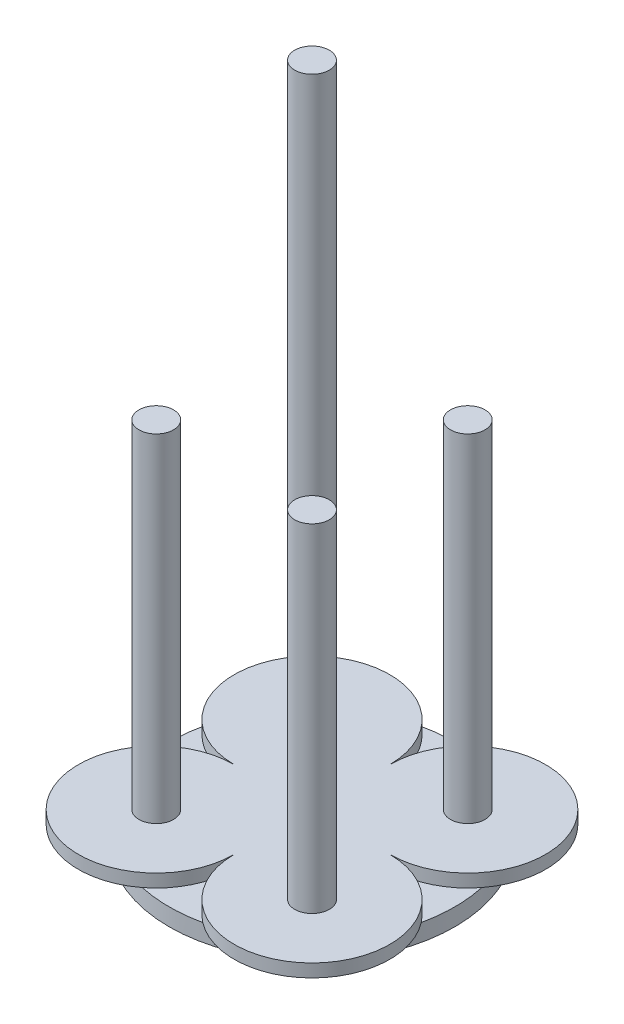
ISO-10303-21;
HEADER;
FILE_DESCRIPTION(('STEP AP214'),'2;1');
FILE_NAME('part.step','',(''),(''),'','','');
FILE_SCHEMA(('AUTOMOTIVE_DESIGN { 1 0 10303 214 1 1 1 1 }'));
ENDSEC;
DATA;
#1=APPLICATION_CONTEXT('core data for automotive mechanical design processes');
#2=APPLICATION_PROTOCOL_DEFINITION('international standard','automotive_design',2000,#1);
#3=PRODUCT_CONTEXT('',#1,'mechanical');
#4=PRODUCT('Part','Part','',(#3));
#5=PRODUCT_RELATED_PRODUCT_CATEGORY('part','',(#4));
#6=PRODUCT_DEFINITION_FORMATION('','',#4);
#7=PRODUCT_DEFINITION_CONTEXT('part definition',#1,'design');
#8=PRODUCT_DEFINITION('design','',#6,#7);
#9=PRODUCT_DEFINITION_SHAPE('','',#8);
#10=(LENGTH_UNIT() NAMED_UNIT(*) SI_UNIT(.MILLI.,.METRE.));
#11=(NAMED_UNIT(*) PLANE_ANGLE_UNIT() SI_UNIT($,.RADIAN.));
#12=(NAMED_UNIT(*) SI_UNIT($,.STERADIAN.) SOLID_ANGLE_UNIT());
#13=UNCERTAINTY_MEASURE_WITH_UNIT(LENGTH_MEASURE(1.E-05),#10,'distance_accuracy_value','');
#14=(GEOMETRIC_REPRESENTATION_CONTEXT(3) GLOBAL_UNCERTAINTY_ASSIGNED_CONTEXT((#13)) GLOBAL_UNIT_ASSIGNED_CONTEXT((#10,
#11,#12)) REPRESENTATION_CONTEXT('',''));
#15=CARTESIAN_POINT('',(0.,0.,0.));
#16=DIRECTION('',(0.,0.,1.));
#17=DIRECTION('',(1.,0.,0.));
#18=AXIS2_PLACEMENT_3D('',#15,#16,#17);
#19=CARTESIAN_POINT('',(0.,4.,0.));
#20=DIRECTION('',(0.,1.,0.));
#21=DIRECTION('',(0.,0.,1.));
#22=AXIS2_PLACEMENT_3D('',#19,#20,#21);
#23=PLANE('',#22);
#24=CARTESIAN_POINT('',(-17.9999999999998,4.,-18.0000000000002));
#25=DIRECTION('',(0.,1.,0.));
#26=DIRECTION('',(0.,0.,1.));
#27=AXIS2_PLACEMENT_3D('',#24,#25,#26);
#28=CIRCLE('',#27,18.);
#29=CARTESIAN_POINT('',(0.,4.,-18.0000000000002));
#30=VERTEX_POINT('',#29);
#31=CARTESIAN_POINT('',(-7.00123768442987,4.,-32.2487623155699));
#32=VERTEX_POINT('',#31);
#33=EDGE_CURVE('E59',#30,#32,#28,.T.);
#34=ORIENTED_EDGE('',*,*,#33,.F.);
#35=CARTESIAN_POINT('',(18.,4.,-18.));
#36=DIRECTION('',(0.,1.,0.));
#37=DIRECTION('',(0.,0.,1.));
#38=AXIS2_PLACEMENT_3D('',#35,#36,#37);
#39=CIRCLE('',#38,18.);
#40=CARTESIAN_POINT('',(7.0012376844302,4.,-32.2487623155698));
#41=VERTEX_POINT('',#40);
#42=EDGE_CURVE('E11',#41,#30,#39,.T.);
#43=ORIENTED_EDGE('',*,*,#42,.F.);
#44=CARTESIAN_POINT('',(0.,4.,0.));
#45=DIRECTION('',(0.,1.,0.));
#46=DIRECTION('',(0.,0.,1.));
#47=AXIS2_PLACEMENT_3D('',#44,#45,#46);
#48=CIRCLE('',#47,33.);
#49=EDGE_CURVE('E166',#41,#32,#48,.T.);
#50=ORIENTED_EDGE('',*,*,#49,.T.);
#51=EDGE_LOOP('',(#34,#43,#50));
#52=FACE_BOUND('',#51,.T.);
#53=ADVANCED_FACE('F40',(#52),#23,.T.);
#54=CARTESIAN_POINT('',(17.9999999999999,4.,0.));
#55=VERTEX_POINT('',#54);
#56=CARTESIAN_POINT('',(32.2487623155698,4.,-7.0012376844302));
#57=VERTEX_POINT('',#56);
#58=EDGE_CURVE('E51',#55,#57,#39,.T.);
#59=ORIENTED_EDGE('',*,*,#58,.F.);
#60=CARTESIAN_POINT('',(17.9999999999999,4.,18.0000000000001));
#61=DIRECTION('',(0.,1.,0.));
#62=DIRECTION('',(0.,0.,1.));
#63=AXIS2_PLACEMENT_3D('',#60,#61,#62);
#64=CIRCLE('',#63,18.);
#65=CARTESIAN_POINT('',(32.2487623155698,4.,7.00123768443031));
#66=VERTEX_POINT('',#65);
#67=EDGE_CURVE('E49',#66,#55,#64,.T.);
#68=ORIENTED_EDGE('',*,*,#67,.F.);
#69=EDGE_CURVE('E144',#66,#57,#48,.T.);
#70=ORIENTED_EDGE('',*,*,#69,.T.);
#71=EDGE_LOOP('',(#59,#68,#70));
#72=FACE_BOUND('',#71,.T.);
#73=ADVANCED_FACE('F258',(#72),#23,.T.);
#74=CARTESIAN_POINT('',(-32.2487623155697,4.,-7.00123768443053));
#75=VERTEX_POINT('',#74);
#76=CARTESIAN_POINT('',(-17.9999999999998,4.,-1.2490009027033E-13));
#77=VERTEX_POINT('',#76);
#78=EDGE_CURVE('E134',#75,#77,#28,.T.);
#79=ORIENTED_EDGE('',*,*,#78,.F.);
#80=CARTESIAN_POINT('',(-32.2487623155698,4.,7.00123768442998));
#81=VERTEX_POINT('',#80);
#82=EDGE_CURVE('E157',#75,#81,#48,.T.);
#83=ORIENTED_EDGE('',*,*,#82,.T.);
#84=CARTESIAN_POINT('',(-18.0000000000001,4.,17.9999999999999));
#85=DIRECTION('',(0.,1.,0.));
#86=DIRECTION('',(0.,0.,1.));
#87=AXIS2_PLACEMENT_3D('',#84,#85,#86);
#88=CIRCLE('',#87,18.);
#89=EDGE_CURVE('E150',#77,#81,#88,.T.);
#90=ORIENTED_EDGE('',*,*,#89,.F.);
#91=EDGE_LOOP('',(#79,#83,#90));
#92=FACE_BOUND('',#91,.T.);
#93=ADVANCED_FACE('F264',(#92),#23,.T.);
#94=CARTESIAN_POINT('',(0.,4.,0.));
#95=DIRECTION('',(0.,-1.,0.));
#96=DIRECTION('',(0.,0.,-1.));
#97=AXIS2_PLACEMENT_3D('',#94,#95,#96);
#98=CYLINDRICAL_SURFACE('',#97,33.);
#99=CARTESIAN_POINT('',(7.00123768443009,4.,32.2487623155698));
#100=VERTEX_POINT('',#99);
#101=EDGE_CURVE('E141',#100,#66,#48,.T.);
#102=ORIENTED_EDGE('',*,*,#101,.F.);
#103=CARTESIAN_POINT('',(-7.00123768443043,4.,32.2487623155697));
#104=VERTEX_POINT('',#103);
#105=EDGE_CURVE('E137',#104,#100,#48,.T.);
#106=ORIENTED_EDGE('',*,*,#105,.F.);
#107=EDGE_CURVE('E153',#81,#104,#48,.T.);
#108=ORIENTED_EDGE('',*,*,#107,.F.);
#109=ORIENTED_EDGE('',*,*,#82,.F.);
#110=EDGE_CURVE('E162',#32,#75,#48,.T.);
#111=ORIENTED_EDGE('',*,*,#110,.F.);
#112=ORIENTED_EDGE('',*,*,#49,.F.);
#113=EDGE_CURVE('E152',#57,#41,#48,.T.);
#114=ORIENTED_EDGE('',*,*,#113,.F.);
#115=ORIENTED_EDGE('',*,*,#69,.F.);
#116=EDGE_LOOP('',(#102,#106,#108,#109,#111,#112,#114,#115));
#117=FACE_BOUND('',#116,.T.);
#118=CARTESIAN_POINT('',(0.,0.,0.));
#119=DIRECTION('',(0.,1.,0.));
#120=DIRECTION('',(0.,0.,1.));
#121=AXIS2_PLACEMENT_3D('',#118,#119,#120);
#122=CIRCLE('',#121,33.);
#123=CARTESIAN_POINT('',(0.,0.,33.));
#124=VERTEX_POINT('',#123);
#125=EDGE_CURVE('E44',#124,#124,#122,.T.);
#126=ORIENTED_EDGE('',*,*,#125,.T.);
#127=EDGE_LOOP('',(#126));
#128=FACE_BOUND('',#127,.T.);
#129=ADVANCED_FACE('F42',(#117,#128),#98,.T.);
#130=CARTESIAN_POINT('',(-1.2490009027033E-13,4.,17.9999999999999));
#131=VERTEX_POINT('',#130);
#132=EDGE_CURVE('E180',#131,#100,#64,.T.);
#133=ORIENTED_EDGE('',*,*,#132,.F.);
#134=EDGE_CURVE('E143',#104,#131,#88,.T.);
#135=ORIENTED_EDGE('',*,*,#134,.F.);
#136=ORIENTED_EDGE('',*,*,#105,.T.);
#137=EDGE_LOOP('',(#133,#135,#136));
#138=FACE_BOUND('',#137,.T.);
#139=ADVANCED_FACE('F260',(#138),#23,.T.);
#140=CARTESIAN_POINT('',(0.,0.,0.));
#141=DIRECTION('',(0.,1.,0.));
#142=DIRECTION('',(0.,0.,1.));
#143=AXIS2_PLACEMENT_3D('',#140,#141,#142);
#144=PLANE('',#143);
#145=ORIENTED_EDGE('',*,*,#125,.F.);
#146=EDGE_LOOP('',(#145));
#147=FACE_BOUND('',#146,.T.);
#148=ADVANCED_FACE('F267',(#147),#144,.F.);
#149=CARTESIAN_POINT('',(-18.,4.,-1.56125112837913E-13));
#150=DIRECTION('',(0.,1.,0.));
#151=DIRECTION('',(0.,0.,1.));
#152=AXIS2_PLACEMENT_3D('',#149,#150,#151);
#153=PLANE('',#152);
#154=EDGE_CURVE('E182',#100,#66,#64,.T.);
#155=ORIENTED_EDGE('',*,*,#154,.F.);
#156=ORIENTED_EDGE('',*,*,#101,.T.);
#157=EDGE_LOOP('',(#155,#156));
#158=FACE_BOUND('',#157,.T.);
#159=ADVANCED_FACE('F272',(#158),#153,.F.);
#160=EDGE_CURVE('E52',#57,#41,#39,.T.);
#161=ORIENTED_EDGE('',*,*,#160,.F.);
#162=ORIENTED_EDGE('',*,*,#113,.T.);
#163=EDGE_LOOP('',(#161,#162));
#164=FACE_BOUND('',#163,.T.);
#165=ADVANCED_FACE('F174',(#164),#153,.F.);
#166=EDGE_CURVE('E190',#32,#75,#28,.T.);
#167=ORIENTED_EDGE('',*,*,#166,.F.);
#168=ORIENTED_EDGE('',*,*,#110,.T.);
#169=EDGE_LOOP('',(#167,#168));
#170=FACE_BOUND('',#169,.T.);
#171=ADVANCED_FACE('F280',(#170),#153,.F.);
#172=EDGE_CURVE('E151',#81,#104,#88,.T.);
#173=ORIENTED_EDGE('',*,*,#172,.F.);
#174=ORIENTED_EDGE('',*,*,#107,.T.);
#175=EDGE_LOOP('',(#173,#174));
#176=FACE_BOUND('',#175,.T.);
#177=ADVANCED_FACE('F278',(#176),#153,.F.);
#178=CARTESIAN_POINT('',(-17.9999999999998,7.,-18.0000000000002));
#179=DIRECTION('',(0.,-1.,0.));
#180=DIRECTION('',(0.,0.,-1.));
#181=AXIS2_PLACEMENT_3D('',#178,#179,#180);
#182=CYLINDRICAL_SURFACE('',#181,18.);
#183=ORIENTED_EDGE('',*,*,#33,.T.);
#184=ORIENTED_EDGE('',*,*,#166,.T.);
#185=ORIENTED_EDGE('',*,*,#78,.T.);
#186=DIRECTION('',(0.,-1.,0.));
#187=VECTOR('',#186,1.);
#188=CARTESIAN_POINT('',(-17.9999999999998,7.,-1.2490009027033E-13));
#189=LINE('',#188,#187);
#190=CARTESIAN_POINT('',(-17.9999999999998,7.,-1.2490009027033E-13));
#191=VERTEX_POINT('',#190);
#192=EDGE_CURVE('E114',#191,#77,#189,.T.);
#193=ORIENTED_EDGE('',*,*,#192,.F.);
#194=CARTESIAN_POINT('',(-17.9999999999998,7.,-18.0000000000002));
#195=DIRECTION('',(0.,1.,0.));
#196=DIRECTION('',(0.,0.,1.));
#197=AXIS2_PLACEMENT_3D('',#194,#195,#196);
#198=CIRCLE('',#197,18.);
#199=CARTESIAN_POINT('',(0.,7.,-18.0000000000002));
#200=VERTEX_POINT('',#199);
#201=EDGE_CURVE('E121',#200,#191,#198,.T.);
#202=ORIENTED_EDGE('',*,*,#201,.F.);
#203=DIRECTION('',(0.,-1.,0.));
#204=VECTOR('',#203,1.);
#205=CARTESIAN_POINT('',(0.,7.,-18.0000000000002));
#206=LINE('',#205,#204);
#207=EDGE_CURVE('E185',#200,#30,#206,.T.);
#208=ORIENTED_EDGE('',*,*,#207,.T.);
#209=EDGE_LOOP('',(#183,#184,#185,#193,#202,#208));
#210=FACE_BOUND('',#209,.T.);
#211=ADVANCED_FACE('F132',(#210),#182,.T.);
#212=CARTESIAN_POINT('',(-18.0000000000001,7.,17.9999999999999));
#213=DIRECTION('',(0.,-1.,0.));
#214=DIRECTION('',(0.,0.,-1.));
#215=AXIS2_PLACEMENT_3D('',#212,#213,#214);
#216=CYLINDRICAL_SURFACE('',#215,18.);
#217=ORIENTED_EDGE('',*,*,#89,.T.);
#218=ORIENTED_EDGE('',*,*,#172,.T.);
#219=ORIENTED_EDGE('',*,*,#134,.T.);
#220=DIRECTION('',(0.,-1.,0.));
#221=VECTOR('',#220,1.);
#222=CARTESIAN_POINT('',(-1.2490009027033E-13,7.,17.9999999999999));
#223=LINE('',#222,#221);
#224=CARTESIAN_POINT('',(-1.2490009027033E-13,7.,17.9999999999999));
#225=VERTEX_POINT('',#224);
#226=EDGE_CURVE('E117',#225,#131,#223,.T.);
#227=ORIENTED_EDGE('',*,*,#226,.F.);
#228=CARTESIAN_POINT('',(-18.0000000000001,7.,17.9999999999999));
#229=DIRECTION('',(0.,1.,0.));
#230=DIRECTION('',(0.,0.,1.));
#231=AXIS2_PLACEMENT_3D('',#228,#229,#230);
#232=CIRCLE('',#231,18.);
#233=EDGE_CURVE('E109',#191,#225,#232,.T.);
#234=ORIENTED_EDGE('',*,*,#233,.F.);
#235=ORIENTED_EDGE('',*,*,#192,.T.);
#236=EDGE_LOOP('',(#217,#218,#219,#227,#234,#235));
#237=FACE_BOUND('',#236,.T.);
#238=ADVANCED_FACE('F112',(#237),#216,.T.);
#239=CARTESIAN_POINT('',(17.9999999999999,7.,18.0000000000001));
#240=DIRECTION('',(0.,-1.,0.));
#241=DIRECTION('',(0.,0.,-1.));
#242=AXIS2_PLACEMENT_3D('',#239,#240,#241);
#243=CYLINDRICAL_SURFACE('',#242,18.);
#244=ORIENTED_EDGE('',*,*,#132,.T.);
#245=ORIENTED_EDGE('',*,*,#154,.T.);
#246=ORIENTED_EDGE('',*,*,#67,.T.);
#247=DIRECTION('',(0.,-1.,0.));
#248=VECTOR('',#247,1.);
#249=CARTESIAN_POINT('',(17.9999999999999,7.,0.));
#250=LINE('',#249,#248);
#251=CARTESIAN_POINT('',(17.9999999999999,7.,0.));
#252=VERTEX_POINT('',#251);
#253=EDGE_CURVE('E138',#252,#55,#250,.T.);
#254=ORIENTED_EDGE('',*,*,#253,.F.);
#255=CARTESIAN_POINT('',(17.9999999999999,7.,18.0000000000001));
#256=DIRECTION('',(0.,1.,0.));
#257=DIRECTION('',(0.,0.,1.));
#258=AXIS2_PLACEMENT_3D('',#255,#256,#257);
#259=CIRCLE('',#258,18.);
#260=EDGE_CURVE('E120',#225,#252,#259,.T.);
#261=ORIENTED_EDGE('',*,*,#260,.F.);
#262=ORIENTED_EDGE('',*,*,#226,.T.);
#263=EDGE_LOOP('',(#244,#245,#246,#254,#261,#262));
#264=FACE_BOUND('',#263,.T.);
#265=ADVANCED_FACE('F188',(#264),#243,.T.);
#266=CARTESIAN_POINT('',(18.,7.,-18.));
#267=DIRECTION('',(0.,-1.,0.));
#268=DIRECTION('',(0.,0.,-1.));
#269=AXIS2_PLACEMENT_3D('',#266,#267,#268);
#270=CYLINDRICAL_SURFACE('',#269,18.);
#271=ORIENTED_EDGE('',*,*,#58,.T.);
#272=ORIENTED_EDGE('',*,*,#160,.T.);
#273=ORIENTED_EDGE('',*,*,#42,.T.);
#274=ORIENTED_EDGE('',*,*,#207,.F.);
#275=CARTESIAN_POINT('',(18.,7.,-18.));
#276=DIRECTION('',(0.,1.,0.));
#277=DIRECTION('',(0.,0.,1.));
#278=AXIS2_PLACEMENT_3D('',#275,#276,#277);
#279=CIRCLE('',#278,18.);
#280=EDGE_CURVE('E126',#252,#200,#279,.T.);
#281=ORIENTED_EDGE('',*,*,#280,.F.);
#282=ORIENTED_EDGE('',*,*,#253,.T.);
#283=EDGE_LOOP('',(#271,#272,#273,#274,#281,#282));
#284=FACE_BOUND('',#283,.T.);
#285=ADVANCED_FACE('F178',(#284),#270,.T.);
#286=CARTESIAN_POINT('',(-18.,7.,-1.56125112837913E-13));
#287=DIRECTION('',(0.,1.,0.));
#288=DIRECTION('',(0.,0.,1.));
#289=AXIS2_PLACEMENT_3D('',#286,#287,#288);
#290=PLANE('',#289);
#291=CARTESIAN_POINT('',(0.,7.,0.));
#292=DIRECTION('',(0.,1.,0.));
#293=DIRECTION('',(0.,0.,1.));
#294=AXIS2_PLACEMENT_3D('',#291,#292,#293);
#295=CIRCLE('',#294,4.);
#296=CARTESIAN_POINT('',(0.,7.,4.));
#297=VERTEX_POINT('',#296);
#298=EDGE_CURVE('E219',#297,#297,#295,.T.);
#299=ORIENTED_EDGE('',*,*,#298,.F.);
#300=EDGE_LOOP('',(#299));
#301=FACE_BOUND('',#300,.T.);
#302=CARTESIAN_POINT('',(-17.9999999999992,7.,17.9999999999998));
#303=DIRECTION('',(0.,1.,0.));
#304=DIRECTION('',(0.,0.,1.));
#305=AXIS2_PLACEMENT_3D('',#302,#303,#304);
#306=CIRCLE('',#305,4.00000000000054);
#307=CARTESIAN_POINT('',(-17.9999999999992,7.,22.0000000000004));
#308=VERTEX_POINT('',#307);
#309=EDGE_CURVE('E213',#308,#308,#306,.T.);
#310=ORIENTED_EDGE('',*,*,#309,.F.);
#311=EDGE_LOOP('',(#310));
#312=FACE_BOUND('',#311,.T.);
#313=CARTESIAN_POINT('',(18.0000000000008,7.,17.9999999999992));
#314=DIRECTION('',(0.,1.,0.));
#315=DIRECTION('',(0.,0.,1.));
#316=AXIS2_PLACEMENT_3D('',#313,#314,#315);
#317=CIRCLE('',#316,4.00000000000142);
#318=CARTESIAN_POINT('',(18.0000000000008,7.,22.0000000000006));
#319=VERTEX_POINT('',#318);
#320=EDGE_CURVE('E207',#319,#319,#317,.T.);
#321=ORIENTED_EDGE('',*,*,#320,.F.);
#322=EDGE_LOOP('',(#321));
#323=FACE_BOUND('',#322,.T.);
#324=CARTESIAN_POINT('',(18.0000000000002,7.,-18.0000000000008));
#325=DIRECTION('',(0.,1.,0.));
#326=DIRECTION('',(0.,0.,1.));
#327=AXIS2_PLACEMENT_3D('',#324,#325,#326);
#328=CIRCLE('',#327,4.00000000000104);
#329=CARTESIAN_POINT('',(18.0000000000002,7.,-13.9999999999998));
#330=VERTEX_POINT('',#329);
#331=EDGE_CURVE('E201',#330,#330,#328,.T.);
#332=ORIENTED_EDGE('',*,*,#331,.F.);
#333=EDGE_LOOP('',(#332));
#334=FACE_BOUND('',#333,.T.);
#335=CARTESIAN_POINT('',(-17.9999999999998,7.,-18.0000000000002));
#336=DIRECTION('',(0.,1.,0.));
#337=DIRECTION('',(0.,0.,1.));
#338=AXIS2_PLACEMENT_3D('',#335,#336,#337);
#339=CIRCLE('',#338,4.);
#340=CARTESIAN_POINT('',(-17.9999999999998,7.,-14.0000000000002));
#341=VERTEX_POINT('',#340);
#342=EDGE_CURVE('E194',#341,#341,#339,.T.);
#343=ORIENTED_EDGE('',*,*,#342,.F.);
#344=EDGE_LOOP('',(#343));
#345=FACE_BOUND('',#344,.T.);
#346=ORIENTED_EDGE('',*,*,#201,.T.);
#347=ORIENTED_EDGE('',*,*,#233,.T.);
#348=ORIENTED_EDGE('',*,*,#260,.T.);
#349=ORIENTED_EDGE('',*,*,#280,.T.);
#350=EDGE_LOOP('',(#346,#347,#348,#349));
#351=FACE_BOUND('',#350,.T.);
#352=ADVANCED_FACE('F124',(#301,#312,#323,#334,#345,#351),#290,.T.);
#353=CARTESIAN_POINT('',(-17.9999999999998,85.,-18.0000000000002));
#354=DIRECTION('',(0.,-1.,0.));
#355=DIRECTION('',(0.,0.,-1.));
#356=AXIS2_PLACEMENT_3D('',#353,#354,#355);
#357=CYLINDRICAL_SURFACE('',#356,4.);
#358=CARTESIAN_POINT('',(-17.9999999999998,85.,-18.0000000000002));
#359=DIRECTION('',(0.,1.,0.));
#360=DIRECTION('',(0.,0.,1.));
#361=AXIS2_PLACEMENT_3D('',#358,#359,#360);
#362=CIRCLE('',#361,4.);
#363=CARTESIAN_POINT('',(-17.9999999999998,85.,-14.0000000000002));
#364=VERTEX_POINT('',#363);
#365=EDGE_CURVE('E197',#364,#364,#362,.T.);
#366=ORIENTED_EDGE('',*,*,#365,.F.);
#367=EDGE_LOOP('',(#366));
#368=FACE_BOUND('',#367,.T.);
#369=ORIENTED_EDGE('',*,*,#342,.T.);
#370=EDGE_LOOP('',(#369));
#371=FACE_BOUND('',#370,.T.);
#372=ADVANCED_FACE('F236',(#368,#371),#357,.T.);
#373=CARTESIAN_POINT('',(-17.9999999999998,85.,-18.0000000000002));
#374=DIRECTION('',(0.,1.,0.));
#375=DIRECTION('',(0.,0.,1.));
#376=AXIS2_PLACEMENT_3D('',#373,#374,#375);
#377=PLANE('',#376);
#378=ORIENTED_EDGE('',*,*,#365,.T.);
#379=EDGE_LOOP('',(#378));
#380=FACE_BOUND('',#379,.T.);
#381=ADVANCED_FACE('F247',(#380),#377,.T.);
#382=CARTESIAN_POINT('',(18.0000000000002,85.,-18.0000000000008));
#383=DIRECTION('',(0.,-1.,0.));
#384=DIRECTION('',(0.,0.,-1.));
#385=AXIS2_PLACEMENT_3D('',#382,#383,#384);
#386=CYLINDRICAL_SURFACE('',#385,4.00000000000104);
#387=CARTESIAN_POINT('',(18.0000000000002,85.,-18.0000000000008));
#388=DIRECTION('',(0.,1.,0.));
#389=DIRECTION('',(0.,0.,1.));
#390=AXIS2_PLACEMENT_3D('',#387,#388,#389);
#391=CIRCLE('',#390,4.00000000000104);
#392=CARTESIAN_POINT('',(18.0000000000002,85.,-13.9999999999998));
#393=VERTEX_POINT('',#392);
#394=EDGE_CURVE('E198',#393,#393,#391,.T.);
#395=ORIENTED_EDGE('',*,*,#394,.F.);
#396=EDGE_LOOP('',(#395));
#397=FACE_BOUND('',#396,.T.);
#398=ORIENTED_EDGE('',*,*,#331,.T.);
#399=EDGE_LOOP('',(#398));
#400=FACE_BOUND('',#399,.T.);
#401=ADVANCED_FACE('F253',(#397,#400),#386,.T.);
#402=CARTESIAN_POINT('',(18.0000000000002,85.,-18.0000000000008));
#403=DIRECTION('',(0.,1.,0.));
#404=DIRECTION('',(0.,0.,1.));
#405=AXIS2_PLACEMENT_3D('',#402,#403,#404);
#406=PLANE('',#405);
#407=ORIENTED_EDGE('',*,*,#394,.T.);
#408=EDGE_LOOP('',(#407));
#409=FACE_BOUND('',#408,.T.);
#410=ADVANCED_FACE('F350',(#409),#406,.T.);
#411=CARTESIAN_POINT('',(18.0000000000008,85.,17.9999999999992));
#412=DIRECTION('',(0.,-1.,0.));
#413=DIRECTION('',(0.,0.,-1.));
#414=AXIS2_PLACEMENT_3D('',#411,#412,#413);
#415=CYLINDRICAL_SURFACE('',#414,4.00000000000142);
#416=CARTESIAN_POINT('',(18.0000000000008,85.,17.9999999999992));
#417=DIRECTION('',(0.,1.,0.));
#418=DIRECTION('',(0.,0.,1.));
#419=AXIS2_PLACEMENT_3D('',#416,#417,#418);
#420=CIRCLE('',#419,4.00000000000142);
#421=CARTESIAN_POINT('',(18.0000000000008,85.,22.0000000000006));
#422=VERTEX_POINT('',#421);
#423=EDGE_CURVE('E204',#422,#422,#420,.T.);
#424=ORIENTED_EDGE('',*,*,#423,.F.);
#425=EDGE_LOOP('',(#424));
#426=FACE_BOUND('',#425,.T.);
#427=ORIENTED_EDGE('',*,*,#320,.T.);
#428=EDGE_LOOP('',(#427));
#429=FACE_BOUND('',#428,.T.);
#430=ADVANCED_FACE('F360',(#426,#429),#415,.T.);
#431=CARTESIAN_POINT('',(18.0000000000008,85.,17.9999999999992));
#432=DIRECTION('',(0.,1.,0.));
#433=DIRECTION('',(0.,0.,1.));
#434=AXIS2_PLACEMENT_3D('',#431,#432,#433);
#435=PLANE('',#434);
#436=ORIENTED_EDGE('',*,*,#423,.T.);
#437=EDGE_LOOP('',(#436));
#438=FACE_BOUND('',#437,.T.);
#439=ADVANCED_FACE('F370',(#438),#435,.T.);
#440=CARTESIAN_POINT('',(-17.9999999999992,85.,17.9999999999998));
#441=DIRECTION('',(0.,-1.,0.));
#442=DIRECTION('',(0.,0.,-1.));
#443=AXIS2_PLACEMENT_3D('',#440,#441,#442);
#444=CYLINDRICAL_SURFACE('',#443,4.00000000000054);
#445=CARTESIAN_POINT('',(-17.9999999999992,85.,17.9999999999998));
#446=DIRECTION('',(0.,1.,0.));
#447=DIRECTION('',(0.,0.,1.));
#448=AXIS2_PLACEMENT_3D('',#445,#446,#447);
#449=CIRCLE('',#448,4.00000000000054);
#450=CARTESIAN_POINT('',(-17.9999999999992,85.,22.0000000000004));
#451=VERTEX_POINT('',#450);
#452=EDGE_CURVE('E210',#451,#451,#449,.T.);
#453=ORIENTED_EDGE('',*,*,#452,.F.);
#454=EDGE_LOOP('',(#453));
#455=FACE_BOUND('',#454,.T.);
#456=ORIENTED_EDGE('',*,*,#309,.T.);
#457=EDGE_LOOP('',(#456));
#458=FACE_BOUND('',#457,.T.);
#459=ADVANCED_FACE('F380',(#455,#458),#444,.T.);
#460=CARTESIAN_POINT('',(-17.9999999999992,85.,17.9999999999998));
#461=DIRECTION('',(0.,1.,0.));
#462=DIRECTION('',(0.,0.,1.));
#463=AXIS2_PLACEMENT_3D('',#460,#461,#462);
#464=PLANE('',#463);
#465=ORIENTED_EDGE('',*,*,#452,.T.);
#466=EDGE_LOOP('',(#465));
#467=FACE_BOUND('',#466,.T.);
#468=ADVANCED_FACE('F230',(#467),#464,.T.);
#469=CARTESIAN_POINT('',(0.,157.,0.));
#470=DIRECTION('',(0.,-1.,0.));
#471=DIRECTION('',(0.,0.,-1.));
#472=AXIS2_PLACEMENT_3D('',#469,#470,#471);
#473=CYLINDRICAL_SURFACE('',#472,4.);
#474=CARTESIAN_POINT('',(0.,157.,0.));
#475=DIRECTION('',(0.,1.,0.));
#476=DIRECTION('',(0.,0.,1.));
#477=AXIS2_PLACEMENT_3D('',#474,#475,#476);
#478=CIRCLE('',#477,4.);
#479=CARTESIAN_POINT('',(0.,157.,4.));
#480=VERTEX_POINT('',#479);
#481=EDGE_CURVE('E216',#480,#480,#478,.T.);
#482=ORIENTED_EDGE('',*,*,#481,.F.);
#483=EDGE_LOOP('',(#482));
#484=FACE_BOUND('',#483,.T.);
#485=ORIENTED_EDGE('',*,*,#298,.T.);
#486=EDGE_LOOP('',(#485));
#487=FACE_BOUND('',#486,.T.);
#488=ADVANCED_FACE('F227',(#484,#487),#473,.T.);
#489=CARTESIAN_POINT('',(0.,157.,0.));
#490=DIRECTION('',(0.,1.,0.));
#491=DIRECTION('',(0.,0.,1.));
#492=AXIS2_PLACEMENT_3D('',#489,#490,#491);
#493=PLANE('',#492);
#494=ORIENTED_EDGE('',*,*,#481,.T.);
#495=EDGE_LOOP('',(#494));
#496=FACE_BOUND('',#495,.T.);
#497=ADVANCED_FACE('F225',(#496),#493,.T.);
#498=CLOSED_SHELL('',(#53,#73,#93,#129,#139,#148,#159,#165,#171,#177,#211,#238,#265,#285,#352,
#372,#381,#401,#410,#430,#439,#459,#468,#488,#497));
#499=MANIFOLD_SOLID_BREP('B2',#498);
#500=ADVANCED_BREP_SHAPE_REPRESENTATION('',(#18,#499),#14);
#501=SHAPE_DEFINITION_REPRESENTATION(#9,#500);
ENDSEC;
END-ISO-10303-21;
